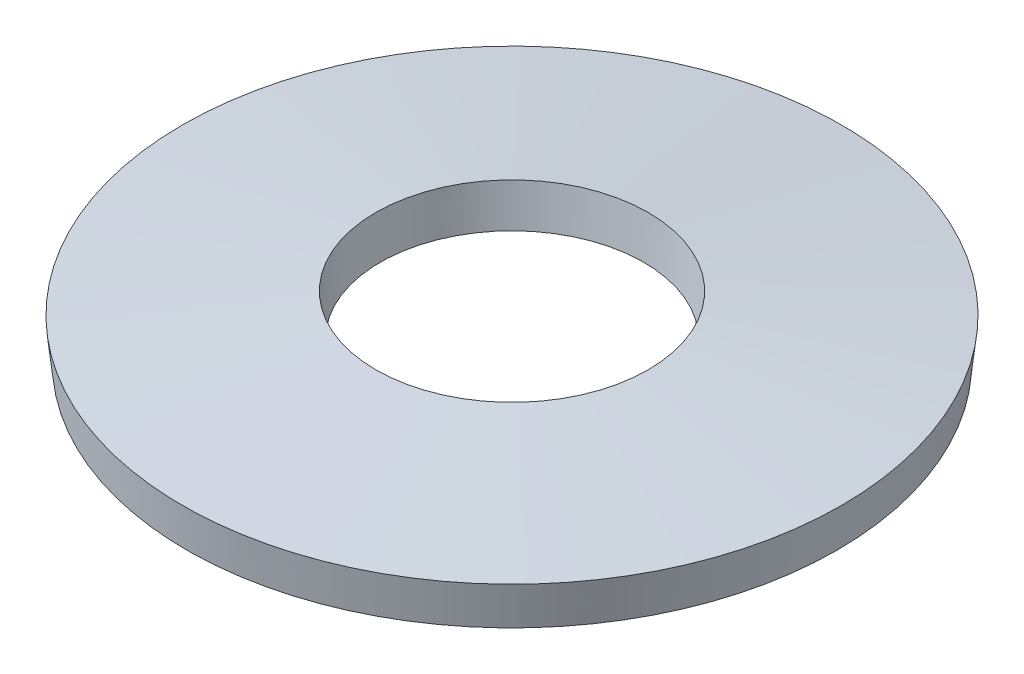
ISO-10303-21;
HEADER;
FILE_DESCRIPTION(('STEP AP214'),'2;1');
FILE_NAME('part.step','',(''),(''),'','','');
FILE_SCHEMA(('AUTOMOTIVE_DESIGN { 1 0 10303 214 1 1 1 1 }'));
ENDSEC;
DATA;
#1=APPLICATION_CONTEXT('core data for automotive mechanical design processes');
#2=APPLICATION_PROTOCOL_DEFINITION('international standard','automotive_design',2000,#1);
#3=PRODUCT_CONTEXT('',#1,'mechanical');
#4=PRODUCT('Part','Part','',(#3));
#5=PRODUCT_RELATED_PRODUCT_CATEGORY('part','',(#4));
#6=PRODUCT_DEFINITION_FORMATION('','',#4);
#7=PRODUCT_DEFINITION_CONTEXT('part definition',#1,'design');
#8=PRODUCT_DEFINITION('design','',#6,#7);
#9=PRODUCT_DEFINITION_SHAPE('','',#8);
#10=(LENGTH_UNIT() NAMED_UNIT(*) SI_UNIT(.MILLI.,.METRE.));
#11=(NAMED_UNIT(*) PLANE_ANGLE_UNIT() SI_UNIT($,.RADIAN.));
#12=(NAMED_UNIT(*) SI_UNIT($,.STERADIAN.) SOLID_ANGLE_UNIT());
#13=UNCERTAINTY_MEASURE_WITH_UNIT(LENGTH_MEASURE(1.E-05),#10,'distance_accuracy_value','');
#14=(GEOMETRIC_REPRESENTATION_CONTEXT(3) GLOBAL_UNCERTAINTY_ASSIGNED_CONTEXT((#13)) GLOBAL_UNIT_ASSIGNED_CONTEXT((#10,
#11,#12)) REPRESENTATION_CONTEXT('',''));
#15=CARTESIAN_POINT('',(0.,0.,0.));
#16=DIRECTION('',(0.,0.,1.));
#17=DIRECTION('',(1.,0.,0.));
#18=AXIS2_PLACEMENT_3D('',#15,#16,#17);
#19=CARTESIAN_POINT('',(0.,0.252878644570034,0.));
#20=DIRECTION('',(0.,-1.,0.));
#21=DIRECTION('',(1.,0.,0.));
#22=AXIS2_PLACEMENT_3D('',#19,#20,#21);
#23=CONICAL_SURFACE('',#22,1.6,1.46343877434843);
#24=CARTESIAN_POINT('',(0.,0.,0.));
#25=DIRECTION('',(0.,-1.,0.));
#26=DIRECTION('',(1.,0.,0.));
#27=AXIS2_PLACEMENT_3D('',#24,#25,#26);
#28=CIRCLE('',#27,3.94642427811524);
#29=CARTESIAN_POINT('',(3.94642427811524,0.,0.));
#30=VERTEX_POINT('',#29);
#31=EDGE_CURVE('E10',#30,#30,#28,.T.);
#32=ORIENTED_EDGE('',*,*,#31,.T.);
#33=EDGE_LOOP('',(#32));
#34=FACE_BOUND('',#33,.T.);
#35=CARTESIAN_POINT('',(0.,0.252878644570034,0.));
#36=DIRECTION('',(0.,-1.,0.));
#37=DIRECTION('',(1.,0.,0.));
#38=AXIS2_PLACEMENT_3D('',#35,#36,#37);
#39=CIRCLE('',#38,1.6);
#40=CARTESIAN_POINT('',(1.6,0.252878644570034,0.));
#41=VERTEX_POINT('',#40);
#42=EDGE_CURVE('E51',#41,#41,#39,.T.);
#43=ORIENTED_EDGE('',*,*,#42,.F.);
#44=EDGE_LOOP('',(#43));
#45=FACE_BOUND('',#44,.T.);
#46=ADVANCED_FACE('F37',(#34,#45),#23,.F.);
#47=CARTESIAN_POINT('',(0.,0.,0.));
#48=DIRECTION('',(0.,1.,0.));
#49=DIRECTION('',(-1.,0.,0.));
#50=AXIS2_PLACEMENT_3D('',#47,#48,#49);
#51=CONICAL_SURFACE('',#50,3.94642427811524,0.107357552446466);
#52=CARTESIAN_POINT('',(0.,0.497121355429966,0.));
#53=DIRECTION('',(0.,-1.,0.));
#54=DIRECTION('',(1.,0.,0.));
#55=AXIS2_PLACEMENT_3D('',#52,#53,#54);
#56=CIRCLE('',#55,4.);
#57=CARTESIAN_POINT('',(4.,0.497121355429966,0.));
#58=VERTEX_POINT('',#57);
#59=EDGE_CURVE('E43',#58,#58,#56,.T.);
#60=ORIENTED_EDGE('',*,*,#59,.T.);
#61=EDGE_LOOP('',(#60));
#62=FACE_BOUND('',#61,.T.);
#63=ORIENTED_EDGE('',*,*,#31,.F.);
#64=EDGE_LOOP('',(#63));
#65=FACE_BOUND('',#64,.T.);
#66=ADVANCED_FACE('F61',(#62,#65),#51,.T.);
#67=CARTESIAN_POINT('',(0.,0.497121355429966,0.));
#68=DIRECTION('',(0.,-1.,0.));
#69=DIRECTION('',(1.,0.,0.));
#70=AXIS2_PLACEMENT_3D('',#67,#68,#69);
#71=CONICAL_SURFACE('',#70,4.,1.46343877434843);
#72=CARTESIAN_POINT('',(0.,0.75,0.));
#73=DIRECTION('',(0.,-1.,0.));
#74=DIRECTION('',(1.,0.,0.));
#75=AXIS2_PLACEMENT_3D('',#72,#73,#74);
#76=CIRCLE('',#75,1.65357572188476);
#77=CARTESIAN_POINT('',(1.65357572188476,0.75,0.));
#78=VERTEX_POINT('',#77);
#79=EDGE_CURVE('E47',#78,#78,#76,.T.);
#80=ORIENTED_EDGE('',*,*,#79,.T.);
#81=EDGE_LOOP('',(#80));
#82=FACE_BOUND('',#81,.T.);
#83=ORIENTED_EDGE('',*,*,#59,.F.);
#84=EDGE_LOOP('',(#83));
#85=FACE_BOUND('',#84,.T.);
#86=ADVANCED_FACE('F65',(#82,#85),#71,.T.);
#87=CARTESIAN_POINT('',(0.,0.75,0.));
#88=DIRECTION('',(0.,1.,0.));
#89=DIRECTION('',(-1.,0.,0.));
#90=AXIS2_PLACEMENT_3D('',#87,#88,#89);
#91=CONICAL_SURFACE('',#90,1.65357572188476,0.107357552446466);
#92=ORIENTED_EDGE('',*,*,#42,.T.);
#93=EDGE_LOOP('',(#92));
#94=FACE_BOUND('',#93,.T.);
#95=ORIENTED_EDGE('',*,*,#79,.F.);
#96=EDGE_LOOP('',(#95));
#97=FACE_BOUND('',#96,.T.);
#98=ADVANCED_FACE('F57',(#94,#97),#91,.F.);
#99=CLOSED_SHELL('',(#46,#66,#86,#98));
#100=MANIFOLD_SOLID_BREP('B2',#99);
#101=ADVANCED_BREP_SHAPE_REPRESENTATION('',(#18,#100),#14);
#102=SHAPE_DEFINITION_REPRESENTATION(#9,#101);
ENDSEC;
END-ISO-10303-21;
